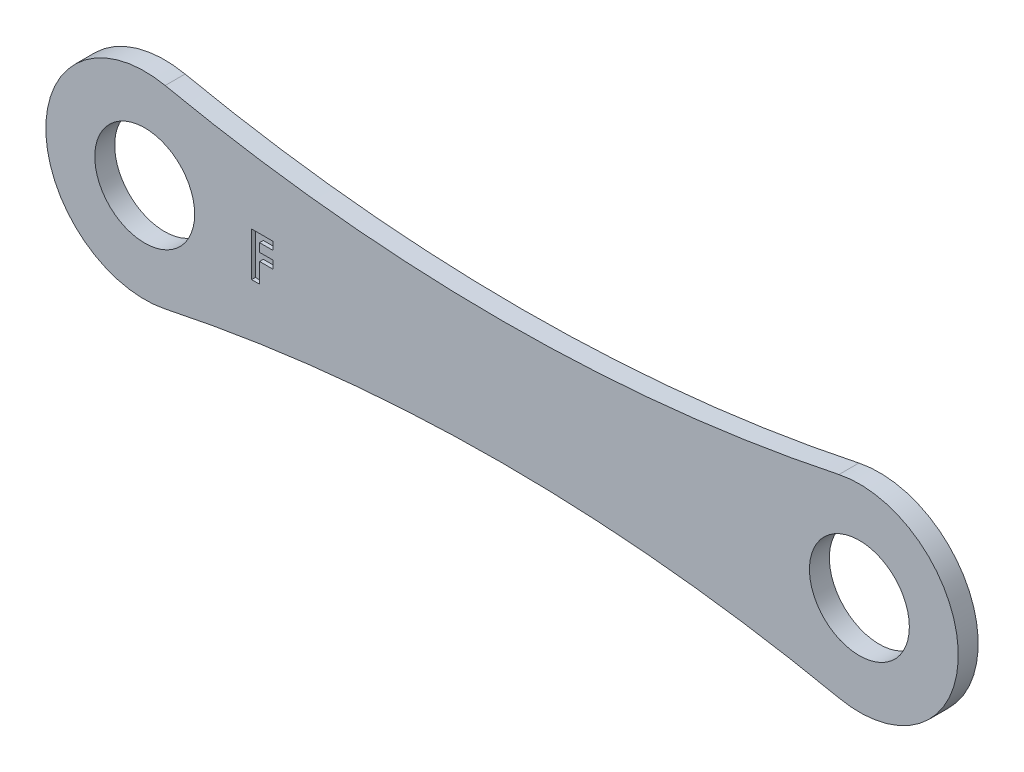
ISO-10303-21;
HEADER;
FILE_DESCRIPTION(('STEP AP214'),'2;1');
FILE_NAME('part.step','',(''),(''),'','','');
FILE_SCHEMA(('AUTOMOTIVE_DESIGN { 1 0 10303 214 1 1 1 1 }'));
ENDSEC;
DATA;
#1=APPLICATION_CONTEXT('core data for automotive mechanical design processes');
#2=APPLICATION_PROTOCOL_DEFINITION('international standard','automotive_design',2000,#1);
#3=PRODUCT_CONTEXT('',#1,'mechanical');
#4=PRODUCT('Part','Part','',(#3));
#5=PRODUCT_RELATED_PRODUCT_CATEGORY('part','',(#4));
#6=PRODUCT_DEFINITION_FORMATION('','',#4);
#7=PRODUCT_DEFINITION_CONTEXT('part definition',#1,'design');
#8=PRODUCT_DEFINITION('design','',#6,#7);
#9=PRODUCT_DEFINITION_SHAPE('','',#8);
#10=(LENGTH_UNIT() NAMED_UNIT(*) SI_UNIT(.MILLI.,.METRE.));
#11=(NAMED_UNIT(*) PLANE_ANGLE_UNIT() SI_UNIT($,.RADIAN.));
#12=(NAMED_UNIT(*) SI_UNIT($,.STERADIAN.) SOLID_ANGLE_UNIT());
#13=UNCERTAINTY_MEASURE_WITH_UNIT(LENGTH_MEASURE(1.E-05),#10,'distance_accuracy_value','');
#14=(GEOMETRIC_REPRESENTATION_CONTEXT(3) GLOBAL_UNCERTAINTY_ASSIGNED_CONTEXT((#13)) GLOBAL_UNIT_ASSIGNED_CONTEXT((#10,
#11,#12)) REPRESENTATION_CONTEXT('',''));
#15=CARTESIAN_POINT('',(0.,0.,0.));
#16=DIRECTION('',(0.,0.,1.));
#17=DIRECTION('',(1.,0.,0.));
#18=AXIS2_PLACEMENT_3D('',#15,#16,#17);
#19=CARTESIAN_POINT('',(0.,0.,1.588));
#20=DIRECTION('',(0.,0.,1.));
#21=DIRECTION('',(1.,0.,0.));
#22=AXIS2_PLACEMENT_3D('',#19,#20,#21);
#23=PLANE('',#22);
#24=CARTESIAN_POINT('',(0.,0.,1.588));
#25=DIRECTION('',(0.,0.,1.));
#26=DIRECTION('',(1.,0.,0.));
#27=AXIS2_PLACEMENT_3D('',#24,#25,#26);
#28=CIRCLE('',#27,3.985);
#29=CARTESIAN_POINT('',(3.985,0.,1.588));
#30=VERTEX_POINT('',#29);
#31=EDGE_CURVE('E181',#30,#30,#28,.T.);
#32=ORIENTED_EDGE('',*,*,#31,.F.);
#33=EDGE_LOOP('',(#32));
#34=FACE_BOUND('',#33,.T.);
#35=CARTESIAN_POINT('',(0.,0.,1.588));
#36=DIRECTION('',(0.,0.,1.));
#37=DIRECTION('',(1.,0.,0.));
#38=AXIS2_PLACEMENT_3D('',#35,#36,#37);
#39=CIRCLE('',#38,7.89);
#40=CARTESIAN_POINT('',(-1.63132859525709,-7.7195120969072,1.588));
#41=VERTEX_POINT('',#40);
#42=CARTESIAN_POINT('',(-1.63132859525709,7.71951209690719,1.588));
#43=VERTEX_POINT('',#42);
#44=EDGE_CURVE('E184',#41,#43,#39,.T.);
#45=ORIENTED_EDGE('',*,*,#44,.T.);
#46=CARTESIAN_POINT('',(-28.51,134.910459194237,1.588));
#47=DIRECTION('',(0.,0.,1.));
#48=DIRECTION('',(1.,0.,0.));
#49=AXIS2_PLACEMENT_3D('',#46,#47,#48);
#50=CIRCLE('',#49,130.);
#51=CARTESIAN_POINT('',(-55.3886714047429,7.71951209690719,1.588));
#52=VERTEX_POINT('',#51);
#53=EDGE_CURVE('E91',#43,#52,#50,.F.);
#54=ORIENTED_EDGE('',*,*,#53,.T.);
#55=CARTESIAN_POINT('',(-57.02,0.,1.588));
#56=DIRECTION('',(0.,0.,1.));
#57=DIRECTION('',(1.,0.,0.));
#58=AXIS2_PLACEMENT_3D('',#55,#56,#57);
#59=CIRCLE('',#58,7.89);
#60=CARTESIAN_POINT('',(-55.3886714047429,-7.71951209690719,1.588));
#61=VERTEX_POINT('',#60);
#62=EDGE_CURVE('E188',#52,#61,#59,.T.);
#63=ORIENTED_EDGE('',*,*,#62,.T.);
#64=CARTESIAN_POINT('',(-28.51,-134.910459194237,1.588));
#65=DIRECTION('',(0.,0.,1.));
#66=DIRECTION('',(1.,0.,0.));
#67=AXIS2_PLACEMENT_3D('',#64,#65,#66);
#68=CIRCLE('',#67,130.);
#69=EDGE_CURVE('E190',#41,#61,#68,.T.);
#70=ORIENTED_EDGE('',*,*,#69,.F.);
#71=EDGE_LOOP('',(#45,#54,#63,#70));
#72=FACE_BOUND('',#71,.T.);
#73=CARTESIAN_POINT('',(-57.02,0.,1.588));
#74=DIRECTION('',(0.,0.,1.));
#75=DIRECTION('',(1.,0.,0.));
#76=AXIS2_PLACEMENT_3D('',#73,#74,#75);
#77=CIRCLE('',#76,3.985);
#78=CARTESIAN_POINT('',(-53.035,0.,1.588));
#79=VERTEX_POINT('',#78);
#80=EDGE_CURVE('E192',#79,#79,#77,.T.);
#81=ORIENTED_EDGE('',*,*,#80,.F.);
#82=EDGE_LOOP('',(#81));
#83=FACE_BOUND('',#82,.T.);
#84=DIRECTION('',(-1.,0.,0.));
#85=VECTOR('',#84,1.);
#86=CARTESIAN_POINT('',(-47.8578537610848,-2.24163128163509,1.588));
#87=LINE('',#86,#85);
#88=CARTESIAN_POINT('',(-47.8578537610848,-2.24163128163509,1.588));
#89=VERTEX_POINT('',#88);
#90=CARTESIAN_POINT('',(-48.4860588892899,-2.24163128163509,1.588));
#91=VERTEX_POINT('',#90);
#92=EDGE_CURVE('E166',#89,#91,#87,.T.);
#93=ORIENTED_EDGE('',*,*,#92,.T.);
#94=DIRECTION('',(0.,1.,0.));
#95=VECTOR('',#94,1.);
#96=CARTESIAN_POINT('',(-48.4860588892899,-2.24163128163509,1.588));
#97=LINE('',#96,#95);
#98=CARTESIAN_POINT('',(-48.4860588892899,1.25836871836491,1.588));
#99=VERTEX_POINT('',#98);
#100=EDGE_CURVE('E56',#91,#99,#97,.T.);
#101=ORIENTED_EDGE('',*,*,#100,.T.);
#102=DIRECTION('',(1.,0.,0.));
#103=VECTOR('',#102,1.);
#104=CARTESIAN_POINT('',(-48.4860588892899,1.25836871836491,1.588));
#105=LINE('',#104,#103);
#106=CARTESIAN_POINT('',(-46.7809306841617,1.25836871836491,1.588));
#107=VERTEX_POINT('',#106);
#108=EDGE_CURVE('E170',#99,#107,#105,.T.);
#109=ORIENTED_EDGE('',*,*,#108,.T.);
#110=DIRECTION('',(0.,-1.,0.));
#111=VECTOR('',#110,1.);
#112=CARTESIAN_POINT('',(-46.7809306841617,1.25836871836491,1.588));
#113=LINE('',#112,#111);
#114=CARTESIAN_POINT('',(-46.7809306841617,0.630163590159787,1.588));
#115=VERTEX_POINT('',#114);
#116=EDGE_CURVE('E424',#107,#115,#113,.T.);
#117=ORIENTED_EDGE('',*,*,#116,.T.);
#118=DIRECTION('',(-1.,0.,0.));
#119=VECTOR('',#118,1.);
#120=CARTESIAN_POINT('',(-46.7809306841617,0.630163590159787,1.588));
#121=LINE('',#120,#119);
#122=CARTESIAN_POINT('',(-47.8578537610848,0.630163590159787,1.588));
#123=VERTEX_POINT('',#122);
#124=EDGE_CURVE('E426',#115,#123,#121,.T.);
#125=ORIENTED_EDGE('',*,*,#124,.T.);
#126=DIRECTION('',(0.,-1.,0.));
#127=VECTOR('',#126,1.);
#128=CARTESIAN_POINT('',(-47.8578537610848,0.630163590159787,1.588));
#129=LINE('',#128,#127);
#130=CARTESIAN_POINT('',(-47.8578537610848,-0.0429133329171365,1.588));
#131=VERTEX_POINT('',#130);
#132=EDGE_CURVE('E430',#123,#131,#129,.T.);
#133=ORIENTED_EDGE('',*,*,#132,.T.);
#134=DIRECTION('',(1.,0.,0.));
#135=VECTOR('',#134,1.);
#136=CARTESIAN_POINT('',(-47.8578537610848,-0.0429133329171365,1.588));
#137=LINE('',#136,#135);
#138=CARTESIAN_POINT('',(-46.7809306841617,-0.0429133329171365,1.588));
#139=VERTEX_POINT('',#138);
#140=EDGE_CURVE('E437',#131,#139,#137,.T.);
#141=ORIENTED_EDGE('',*,*,#140,.T.);
#142=DIRECTION('',(0.,-1.,0.));
#143=VECTOR('',#142,1.);
#144=CARTESIAN_POINT('',(-46.7809306841617,-0.0429133329171365,1.588));
#145=LINE('',#144,#143);
#146=CARTESIAN_POINT('',(-46.7809306841617,-0.671118461122265,1.588));
#147=VERTEX_POINT('',#146);
#148=EDGE_CURVE('E404',#139,#147,#145,.T.);
#149=ORIENTED_EDGE('',*,*,#148,.T.);
#150=DIRECTION('',(-1.,0.,0.));
#151=VECTOR('',#150,1.);
#152=CARTESIAN_POINT('',(-46.7809306841617,-0.671118461122265,1.588));
#153=LINE('',#152,#151);
#154=CARTESIAN_POINT('',(-47.8578537610848,-0.671118461122265,1.588));
#155=VERTEX_POINT('',#154);
#156=EDGE_CURVE('E401',#147,#155,#153,.T.);
#157=ORIENTED_EDGE('',*,*,#156,.T.);
#158=DIRECTION('',(0.,-1.,0.));
#159=VECTOR('',#158,1.);
#160=CARTESIAN_POINT('',(-47.8578537610848,-0.671118461122265,1.588));
#161=LINE('',#160,#159);
#162=EDGE_CURVE('E395',#155,#89,#161,.T.);
#163=ORIENTED_EDGE('',*,*,#162,.T.);
#164=EDGE_LOOP('',(#93,#101,#109,#117,#125,#133,#141,#149,#157,#163));
#165=FACE_BOUND('',#164,.T.);
#166=ADVANCED_FACE('F41',(#34,#72,#83,#165),#23,.T.);
#167=CARTESIAN_POINT('',(0.,0.,1.588));
#168=DIRECTION('',(0.,0.,-1.));
#169=DIRECTION('',(-1.,0.,0.));
#170=AXIS2_PLACEMENT_3D('',#167,#168,#169);
#171=CYLINDRICAL_SURFACE('',#170,7.89);
#172=CARTESIAN_POINT('',(0.,0.,0.));
#173=DIRECTION('',(0.,0.,1.));
#174=DIRECTION('',(1.,0.,0.));
#175=AXIS2_PLACEMENT_3D('',#172,#173,#174);
#176=CIRCLE('',#175,7.89);
#177=CARTESIAN_POINT('',(-1.63132859525709,-7.7195120969072,0.));
#178=VERTEX_POINT('',#177);
#179=CARTESIAN_POINT('',(-1.63132859525709,7.71951209690719,0.));
#180=VERTEX_POINT('',#179);
#181=EDGE_CURVE('E175',#178,#180,#176,.T.);
#182=ORIENTED_EDGE('',*,*,#181,.T.);
#183=DIRECTION('',(0.,0.,-1.));
#184=VECTOR('',#183,1.);
#185=CARTESIAN_POINT('',(-1.63132859525709,7.71951209690719,1.588));
#186=LINE('',#185,#184);
#187=EDGE_CURVE('E11',#43,#180,#186,.T.);
#188=ORIENTED_EDGE('',*,*,#187,.F.);
#189=ORIENTED_EDGE('',*,*,#44,.F.);
#190=DIRECTION('',(0.,0.,-1.));
#191=VECTOR('',#190,1.);
#192=CARTESIAN_POINT('',(-1.63132859525709,-7.7195120969072,1.588));
#193=LINE('',#192,#191);
#194=EDGE_CURVE('E65',#41,#178,#193,.T.);
#195=ORIENTED_EDGE('',*,*,#194,.T.);
#196=EDGE_LOOP('',(#182,#188,#189,#195));
#197=FACE_BOUND('',#196,.T.);
#198=ADVANCED_FACE('F222',(#197),#171,.T.);
#199=CARTESIAN_POINT('',(-28.51,134.910459194237,1.588));
#200=DIRECTION('',(0.,0.,-1.));
#201=DIRECTION('',(-1.,0.,0.));
#202=AXIS2_PLACEMENT_3D('',#199,#200,#201);
#203=CYLINDRICAL_SURFACE('',#202,130.);
#204=CARTESIAN_POINT('',(-28.51,134.910459194237,0.));
#205=DIRECTION('',(0.,0.,1.));
#206=DIRECTION('',(1.,0.,0.));
#207=AXIS2_PLACEMENT_3D('',#204,#205,#206);
#208=CIRCLE('',#207,130.);
#209=CARTESIAN_POINT('',(-55.3886714047429,7.71951209690719,0.));
#210=VERTEX_POINT('',#209);
#211=EDGE_CURVE('E196',#180,#210,#208,.F.);
#212=ORIENTED_EDGE('',*,*,#211,.T.);
#213=DIRECTION('',(0.,0.,-1.));
#214=VECTOR('',#213,1.);
#215=CARTESIAN_POINT('',(-55.3886714047429,7.71951209690719,1.588));
#216=LINE('',#215,#214);
#217=EDGE_CURVE('E49',#52,#210,#216,.T.);
#218=ORIENTED_EDGE('',*,*,#217,.F.);
#219=ORIENTED_EDGE('',*,*,#53,.F.);
#220=ORIENTED_EDGE('',*,*,#187,.T.);
#221=EDGE_LOOP('',(#212,#218,#219,#220));
#222=FACE_BOUND('',#221,.T.);
#223=ADVANCED_FACE('F223',(#222),#203,.F.);
#224=CARTESIAN_POINT('',(-57.02,0.,1.588));
#225=DIRECTION('',(0.,0.,-1.));
#226=DIRECTION('',(-1.,0.,0.));
#227=AXIS2_PLACEMENT_3D('',#224,#225,#226);
#228=CYLINDRICAL_SURFACE('',#227,7.89);
#229=CARTESIAN_POINT('',(-57.02,0.,0.));
#230=DIRECTION('',(0.,0.,1.));
#231=DIRECTION('',(1.,0.,0.));
#232=AXIS2_PLACEMENT_3D('',#229,#230,#231);
#233=CIRCLE('',#232,7.89);
#234=CARTESIAN_POINT('',(-55.3886714047429,-7.71951209690719,0.));
#235=VERTEX_POINT('',#234);
#236=EDGE_CURVE('E198',#210,#235,#233,.T.);
#237=ORIENTED_EDGE('',*,*,#236,.T.);
#238=DIRECTION('',(0.,0.,-1.));
#239=VECTOR('',#238,1.);
#240=CARTESIAN_POINT('',(-55.3886714047429,-7.71951209690719,1.588));
#241=LINE('',#240,#239);
#242=EDGE_CURVE('E207',#61,#235,#241,.T.);
#243=ORIENTED_EDGE('',*,*,#242,.F.);
#244=ORIENTED_EDGE('',*,*,#62,.F.);
#245=ORIENTED_EDGE('',*,*,#217,.T.);
#246=EDGE_LOOP('',(#237,#243,#244,#245));
#247=FACE_BOUND('',#246,.T.);
#248=ADVANCED_FACE('F212',(#247),#228,.T.);
#249=CARTESIAN_POINT('',(-28.51,-134.910459194237,1.588));
#250=DIRECTION('',(0.,0.,-1.));
#251=DIRECTION('',(-1.,0.,0.));
#252=AXIS2_PLACEMENT_3D('',#249,#250,#251);
#253=CYLINDRICAL_SURFACE('',#252,130.);
#254=CARTESIAN_POINT('',(-28.51,-134.910459194237,0.));
#255=DIRECTION('',(0.,0.,1.));
#256=DIRECTION('',(1.,0.,0.));
#257=AXIS2_PLACEMENT_3D('',#254,#255,#256);
#258=CIRCLE('',#257,130.);
#259=EDGE_CURVE('E201',#178,#235,#258,.T.);
#260=ORIENTED_EDGE('',*,*,#259,.F.);
#261=ORIENTED_EDGE('',*,*,#194,.F.);
#262=ORIENTED_EDGE('',*,*,#69,.T.);
#263=ORIENTED_EDGE('',*,*,#242,.T.);
#264=EDGE_LOOP('',(#260,#261,#262,#263));
#265=FACE_BOUND('',#264,.T.);
#266=ADVANCED_FACE('F217',(#265),#253,.F.);
#267=CARTESIAN_POINT('',(0.,0.,1.588));
#268=DIRECTION('',(0.,0.,-1.));
#269=DIRECTION('',(-1.,0.,0.));
#270=AXIS2_PLACEMENT_3D('',#267,#268,#269);
#271=CYLINDRICAL_SURFACE('',#270,3.985);
#272=ORIENTED_EDGE('',*,*,#31,.T.);
#273=EDGE_LOOP('',(#272));
#274=FACE_BOUND('',#273,.T.);
#275=CARTESIAN_POINT('',(0.,0.,0.));
#276=DIRECTION('',(0.,0.,1.));
#277=DIRECTION('',(1.,0.,0.));
#278=AXIS2_PLACEMENT_3D('',#275,#276,#277);
#279=CIRCLE('',#278,3.985);
#280=CARTESIAN_POINT('',(3.985,0.,0.));
#281=VERTEX_POINT('',#280);
#282=EDGE_CURVE('E171',#281,#281,#279,.T.);
#283=ORIENTED_EDGE('',*,*,#282,.F.);
#284=EDGE_LOOP('',(#283));
#285=FACE_BOUND('',#284,.T.);
#286=ADVANCED_FACE('F43',(#274,#285),#271,.F.);
#287=CARTESIAN_POINT('',(-57.02,0.,1.588));
#288=DIRECTION('',(0.,0.,-1.));
#289=DIRECTION('',(-1.,0.,0.));
#290=AXIS2_PLACEMENT_3D('',#287,#288,#289);
#291=CYLINDRICAL_SURFACE('',#290,3.985);
#292=ORIENTED_EDGE('',*,*,#80,.T.);
#293=EDGE_LOOP('',(#292));
#294=FACE_BOUND('',#293,.T.);
#295=CARTESIAN_POINT('',(-57.02,0.,0.));
#296=DIRECTION('',(0.,0.,1.));
#297=DIRECTION('',(1.,0.,0.));
#298=AXIS2_PLACEMENT_3D('',#295,#296,#297);
#299=CIRCLE('',#298,3.985);
#300=CARTESIAN_POINT('',(-53.035,0.,0.));
#301=VERTEX_POINT('',#300);
#302=EDGE_CURVE('E185',#301,#301,#299,.T.);
#303=ORIENTED_EDGE('',*,*,#302,.F.);
#304=EDGE_LOOP('',(#303));
#305=FACE_BOUND('',#304,.T.);
#306=ADVANCED_FACE('F243',(#294,#305),#291,.F.);
#307=CARTESIAN_POINT('',(0.,0.,0.));
#308=DIRECTION('',(0.,0.,1.));
#309=DIRECTION('',(1.,0.,0.));
#310=AXIS2_PLACEMENT_3D('',#307,#308,#309);
#311=PLANE('',#310);
#312=ORIENTED_EDGE('',*,*,#282,.T.);
#313=EDGE_LOOP('',(#312));
#314=FACE_BOUND('',#313,.T.);
#315=ORIENTED_EDGE('',*,*,#181,.F.);
#316=ORIENTED_EDGE('',*,*,#259,.T.);
#317=ORIENTED_EDGE('',*,*,#236,.F.);
#318=ORIENTED_EDGE('',*,*,#211,.F.);
#319=EDGE_LOOP('',(#315,#316,#317,#318));
#320=FACE_BOUND('',#319,.T.);
#321=ORIENTED_EDGE('',*,*,#302,.T.);
#322=EDGE_LOOP('',(#321));
#323=FACE_BOUND('',#322,.T.);
#324=ADVANCED_FACE('F215',(#314,#320,#323),#311,.F.);
#325=CARTESIAN_POINT('',(-48.4860588892899,-2.24163128163509,1.288));
#326=DIRECTION('',(1.,0.,0.));
#327=DIRECTION('',(0.,0.,-1.));
#328=AXIS2_PLACEMENT_3D('',#325,#326,#327);
#329=PLANE('',#328);
#330=ORIENTED_EDGE('',*,*,#100,.F.);
#331=DIRECTION('',(0.,0.,1.));
#332=VECTOR('',#331,1.);
#333=CARTESIAN_POINT('',(-48.4860588892899,-2.24163128163509,1.288));
#334=LINE('',#333,#332);
#335=CARTESIAN_POINT('',(-48.4860588892899,-2.24163128163509,1.288));
#336=VERTEX_POINT('',#335);
#337=EDGE_CURVE('E165',#336,#91,#334,.T.);
#338=ORIENTED_EDGE('',*,*,#337,.F.);
#339=DIRECTION('',(0.,1.,0.));
#340=VECTOR('',#339,1.);
#341=CARTESIAN_POINT('',(-48.4860588892899,-2.24163128163509,1.288));
#342=LINE('',#341,#340);
#343=CARTESIAN_POINT('',(-48.4860588892899,1.25836871836491,1.288));
#344=VERTEX_POINT('',#343);
#345=EDGE_CURVE('E156',#336,#344,#342,.T.);
#346=ORIENTED_EDGE('',*,*,#345,.T.);
#347=DIRECTION('',(0.,0.,1.));
#348=VECTOR('',#347,1.);
#349=CARTESIAN_POINT('',(-48.4860588892899,1.25836871836491,1.288));
#350=LINE('',#349,#348);
#351=EDGE_CURVE('E164',#344,#99,#350,.T.);
#352=ORIENTED_EDGE('',*,*,#351,.T.);
#353=EDGE_LOOP('',(#330,#338,#346,#352));
#354=FACE_BOUND('',#353,.T.);
#355=ADVANCED_FACE('F163',(#354),#329,.T.);
#356=CARTESIAN_POINT('',(-48.4860588892899,1.25836871836491,1.288));
#357=DIRECTION('',(0.,-1.,0.));
#358=DIRECTION('',(0.,0.,-1.));
#359=AXIS2_PLACEMENT_3D('',#356,#357,#358);
#360=PLANE('',#359);
#361=ORIENTED_EDGE('',*,*,#108,.F.);
#362=ORIENTED_EDGE('',*,*,#351,.F.);
#363=DIRECTION('',(1.,0.,0.));
#364=VECTOR('',#363,1.);
#365=CARTESIAN_POINT('',(-48.4860588892899,1.25836871836491,1.288));
#366=LINE('',#365,#364);
#367=CARTESIAN_POINT('',(-46.7809306841617,1.25836871836491,1.288));
#368=VERTEX_POINT('',#367);
#369=EDGE_CURVE('E152',#344,#368,#366,.T.);
#370=ORIENTED_EDGE('',*,*,#369,.T.);
#371=DIRECTION('',(0.,0.,1.));
#372=VECTOR('',#371,1.);
#373=CARTESIAN_POINT('',(-46.7809306841617,1.25836871836491,1.288));
#374=LINE('',#373,#372);
#375=EDGE_CURVE('E172',#368,#107,#374,.T.);
#376=ORIENTED_EDGE('',*,*,#375,.T.);
#377=EDGE_LOOP('',(#361,#362,#370,#376));
#378=FACE_BOUND('',#377,.T.);
#379=ADVANCED_FACE('F168',(#378),#360,.T.);
#380=CARTESIAN_POINT('',(-46.7809306841617,1.25836871836491,1.288));
#381=DIRECTION('',(-1.,0.,0.));
#382=DIRECTION('',(0.,0.,1.));
#383=AXIS2_PLACEMENT_3D('',#380,#381,#382);
#384=PLANE('',#383);
#385=ORIENTED_EDGE('',*,*,#116,.F.);
#386=ORIENTED_EDGE('',*,*,#375,.F.);
#387=DIRECTION('',(0.,-1.,0.));
#388=VECTOR('',#387,1.);
#389=CARTESIAN_POINT('',(-46.7809306841617,1.25836871836491,1.288));
#390=LINE('',#389,#388);
#391=CARTESIAN_POINT('',(-46.7809306841617,0.630163590159787,1.288));
#392=VERTEX_POINT('',#391);
#393=EDGE_CURVE('E158',#368,#392,#390,.T.);
#394=ORIENTED_EDGE('',*,*,#393,.T.);
#395=DIRECTION('',(0.,0.,1.));
#396=VECTOR('',#395,1.);
#397=CARTESIAN_POINT('',(-46.7809306841617,0.630163590159787,1.288));
#398=LINE('',#397,#396);
#399=EDGE_CURVE('E177',#392,#115,#398,.T.);
#400=ORIENTED_EDGE('',*,*,#399,.T.);
#401=EDGE_LOOP('',(#385,#386,#394,#400));
#402=FACE_BOUND('',#401,.T.);
#403=ADVANCED_FACE('F300',(#402),#384,.T.);
#404=CARTESIAN_POINT('',(-46.7809306841617,0.630163590159787,1.288));
#405=DIRECTION('',(0.,1.,0.));
#406=DIRECTION('',(0.,0.,1.));
#407=AXIS2_PLACEMENT_3D('',#404,#405,#406);
#408=PLANE('',#407);
#409=ORIENTED_EDGE('',*,*,#124,.F.);
#410=ORIENTED_EDGE('',*,*,#399,.F.);
#411=DIRECTION('',(-1.,0.,0.));
#412=VECTOR('',#411,1.);
#413=CARTESIAN_POINT('',(-46.7809306841617,0.630163590159787,1.288));
#414=LINE('',#413,#412);
#415=CARTESIAN_POINT('',(-47.8578537610848,0.630163590159787,1.288));
#416=VERTEX_POINT('',#415);
#417=EDGE_CURVE('E458',#392,#416,#414,.T.);
#418=ORIENTED_EDGE('',*,*,#417,.T.);
#419=DIRECTION('',(0.,0.,1.));
#420=VECTOR('',#419,1.);
#421=CARTESIAN_POINT('',(-47.8578537610848,0.630163590159787,1.288));
#422=LINE('',#421,#420);
#423=EDGE_CURVE('E419',#416,#123,#422,.T.);
#424=ORIENTED_EDGE('',*,*,#423,.T.);
#425=EDGE_LOOP('',(#409,#410,#418,#424));
#426=FACE_BOUND('',#425,.T.);
#427=ADVANCED_FACE('F308',(#426),#408,.T.);
#428=CARTESIAN_POINT('',(-47.8578537610848,0.630163590159787,1.288));
#429=DIRECTION('',(-1.,0.,0.));
#430=DIRECTION('',(0.,0.,1.));
#431=AXIS2_PLACEMENT_3D('',#428,#429,#430);
#432=PLANE('',#431);
#433=ORIENTED_EDGE('',*,*,#132,.F.);
#434=ORIENTED_EDGE('',*,*,#423,.F.);
#435=DIRECTION('',(0.,-1.,0.));
#436=VECTOR('',#435,1.);
#437=CARTESIAN_POINT('',(-47.8578537610848,0.630163590159787,1.288));
#438=LINE('',#437,#436);
#439=CARTESIAN_POINT('',(-47.8578537610848,-0.0429133329171365,1.288));
#440=VERTEX_POINT('',#439);
#441=EDGE_CURVE('E456',#416,#440,#438,.T.);
#442=ORIENTED_EDGE('',*,*,#441,.T.);
#443=DIRECTION('',(0.,0.,1.));
#444=VECTOR('',#443,1.);
#445=CARTESIAN_POINT('',(-47.8578537610848,-0.0429133329171365,1.288));
#446=LINE('',#445,#444);
#447=EDGE_CURVE('E417',#440,#131,#446,.T.);
#448=ORIENTED_EDGE('',*,*,#447,.T.);
#449=EDGE_LOOP('',(#433,#434,#442,#448));
#450=FACE_BOUND('',#449,.T.);
#451=ADVANCED_FACE('F318',(#450),#432,.T.);
#452=CARTESIAN_POINT('',(-47.8578537610848,-0.0429133329171365,1.288));
#453=DIRECTION('',(0.,-1.,0.));
#454=DIRECTION('',(0.,0.,-1.));
#455=AXIS2_PLACEMENT_3D('',#452,#453,#454);
#456=PLANE('',#455);
#457=ORIENTED_EDGE('',*,*,#140,.F.);
#458=ORIENTED_EDGE('',*,*,#447,.F.);
#459=DIRECTION('',(1.,0.,0.));
#460=VECTOR('',#459,1.);
#461=CARTESIAN_POINT('',(-47.8578537610848,-0.0429133329171365,1.288));
#462=LINE('',#461,#460);
#463=CARTESIAN_POINT('',(-46.7809306841617,-0.0429133329171365,1.288));
#464=VERTEX_POINT('',#463);
#465=EDGE_CURVE('E454',#440,#464,#462,.T.);
#466=ORIENTED_EDGE('',*,*,#465,.T.);
#467=DIRECTION('',(0.,0.,1.));
#468=VECTOR('',#467,1.);
#469=CARTESIAN_POINT('',(-46.7809306841617,-0.0429133329171365,1.288));
#470=LINE('',#469,#468);
#471=EDGE_CURVE('E415',#464,#139,#470,.T.);
#472=ORIENTED_EDGE('',*,*,#471,.T.);
#473=EDGE_LOOP('',(#457,#458,#466,#472));
#474=FACE_BOUND('',#473,.T.);
#475=ADVANCED_FACE('F328',(#474),#456,.T.);
#476=CARTESIAN_POINT('',(-46.7809306841617,-0.0429133329171365,1.288));
#477=DIRECTION('',(-1.,0.,0.));
#478=DIRECTION('',(0.,0.,1.));
#479=AXIS2_PLACEMENT_3D('',#476,#477,#478);
#480=PLANE('',#479);
#481=ORIENTED_EDGE('',*,*,#148,.F.);
#482=ORIENTED_EDGE('',*,*,#471,.F.);
#483=DIRECTION('',(0.,-1.,0.));
#484=VECTOR('',#483,1.);
#485=CARTESIAN_POINT('',(-46.7809306841617,-0.0429133329171365,1.288));
#486=LINE('',#485,#484);
#487=CARTESIAN_POINT('',(-46.7809306841617,-0.671118461122265,1.288));
#488=VERTEX_POINT('',#487);
#489=EDGE_CURVE('E444',#464,#488,#486,.T.);
#490=ORIENTED_EDGE('',*,*,#489,.T.);
#491=DIRECTION('',(0.,0.,1.));
#492=VECTOR('',#491,1.);
#493=CARTESIAN_POINT('',(-46.7809306841617,-0.671118461122265,1.288));
#494=LINE('',#493,#492);
#495=EDGE_CURVE('E413',#488,#147,#494,.T.);
#496=ORIENTED_EDGE('',*,*,#495,.T.);
#497=EDGE_LOOP('',(#481,#482,#490,#496));
#498=FACE_BOUND('',#497,.T.);
#499=ADVANCED_FACE('F338',(#498),#480,.T.);
#500=CARTESIAN_POINT('',(-46.7809306841617,-0.671118461122265,1.288));
#501=DIRECTION('',(0.,1.,0.));
#502=DIRECTION('',(0.,0.,1.));
#503=AXIS2_PLACEMENT_3D('',#500,#501,#502);
#504=PLANE('',#503);
#505=ORIENTED_EDGE('',*,*,#156,.F.);
#506=ORIENTED_EDGE('',*,*,#495,.F.);
#507=DIRECTION('',(-1.,0.,0.));
#508=VECTOR('',#507,1.);
#509=CARTESIAN_POINT('',(-46.7809306841617,-0.671118461122265,1.288));
#510=LINE('',#509,#508);
#511=CARTESIAN_POINT('',(-47.8578537610848,-0.671118461122265,1.288));
#512=VERTEX_POINT('',#511);
#513=EDGE_CURVE('E446',#488,#512,#510,.T.);
#514=ORIENTED_EDGE('',*,*,#513,.T.);
#515=DIRECTION('',(0.,0.,1.));
#516=VECTOR('',#515,1.);
#517=CARTESIAN_POINT('',(-47.8578537610848,-0.671118461122265,1.288));
#518=LINE('',#517,#516);
#519=EDGE_CURVE('E411',#512,#155,#518,.T.);
#520=ORIENTED_EDGE('',*,*,#519,.T.);
#521=EDGE_LOOP('',(#505,#506,#514,#520));
#522=FACE_BOUND('',#521,.T.);
#523=ADVANCED_FACE('F348',(#522),#504,.T.);
#524=CARTESIAN_POINT('',(-47.8578537610848,-0.671118461122265,1.288));
#525=DIRECTION('',(-1.,0.,0.));
#526=DIRECTION('',(0.,0.,1.));
#527=AXIS2_PLACEMENT_3D('',#524,#525,#526);
#528=PLANE('',#527);
#529=ORIENTED_EDGE('',*,*,#162,.F.);
#530=ORIENTED_EDGE('',*,*,#519,.F.);
#531=DIRECTION('',(0.,-1.,0.));
#532=VECTOR('',#531,1.);
#533=CARTESIAN_POINT('',(-47.8578537610848,-0.671118461122265,1.288));
#534=LINE('',#533,#532);
#535=CARTESIAN_POINT('',(-47.8578537610848,-2.24163128163509,1.288));
#536=VERTEX_POINT('',#535);
#537=EDGE_CURVE('E448',#512,#536,#534,.T.);
#538=ORIENTED_EDGE('',*,*,#537,.T.);
#539=DIRECTION('',(0.,0.,1.));
#540=VECTOR('',#539,1.);
#541=CARTESIAN_POINT('',(-47.8578537610848,-2.24163128163509,1.288));
#542=LINE('',#541,#540);
#543=EDGE_CURVE('E393',#536,#89,#542,.T.);
#544=ORIENTED_EDGE('',*,*,#543,.T.);
#545=EDGE_LOOP('',(#529,#530,#538,#544));
#546=FACE_BOUND('',#545,.T.);
#547=ADVANCED_FACE('F358',(#546),#528,.T.);
#548=CARTESIAN_POINT('',(-47.8578537610848,-2.24163128163509,1.288));
#549=DIRECTION('',(0.,1.,0.));
#550=DIRECTION('',(0.,0.,1.));
#551=AXIS2_PLACEMENT_3D('',#548,#549,#550);
#552=PLANE('',#551);
#553=ORIENTED_EDGE('',*,*,#92,.F.);
#554=ORIENTED_EDGE('',*,*,#543,.F.);
#555=DIRECTION('',(-1.,0.,0.));
#556=VECTOR('',#555,1.);
#557=CARTESIAN_POINT('',(-47.8578537610848,-2.24163128163509,1.288));
#558=LINE('',#557,#556);
#559=EDGE_CURVE('E409',#536,#336,#558,.T.);
#560=ORIENTED_EDGE('',*,*,#559,.T.);
#561=ORIENTED_EDGE('',*,*,#337,.T.);
#562=EDGE_LOOP('',(#553,#554,#560,#561));
#563=FACE_BOUND('',#562,.T.);
#564=ADVANCED_FACE('F368',(#563),#552,.T.);
#565=CARTESIAN_POINT('',(0.,0.,1.288));
#566=DIRECTION('',(0.,0.,-1.));
#567=DIRECTION('',(-1.,0.,0.));
#568=AXIS2_PLACEMENT_3D('',#565,#566,#567);
#569=PLANE('',#568);
#570=ORIENTED_EDGE('',*,*,#345,.F.);
#571=ORIENTED_EDGE('',*,*,#559,.F.);
#572=ORIENTED_EDGE('',*,*,#537,.F.);
#573=ORIENTED_EDGE('',*,*,#513,.F.);
#574=ORIENTED_EDGE('',*,*,#489,.F.);
#575=ORIENTED_EDGE('',*,*,#465,.F.);
#576=ORIENTED_EDGE('',*,*,#441,.F.);
#577=ORIENTED_EDGE('',*,*,#417,.F.);
#578=ORIENTED_EDGE('',*,*,#393,.F.);
#579=ORIENTED_EDGE('',*,*,#369,.F.);
#580=EDGE_LOOP('',(#570,#571,#572,#573,#574,#575,#576,#577,#578,#579));
#581=FACE_BOUND('',#580,.T.);
#582=ADVANCED_FACE('F154',(#581),#569,.F.);
#583=CLOSED_SHELL('',(#166,#198,#223,#248,#266,#286,#306,#324,#355,#379,#403,#427,#451,#475,
#499,#523,#547,#564,#582));
#584=MANIFOLD_SOLID_BREP('B2',#583);
#585=ADVANCED_BREP_SHAPE_REPRESENTATION('',(#18,#584),#14);
#586=SHAPE_DEFINITION_REPRESENTATION(#9,#585);
ENDSEC;
END-ISO-10303-21;
